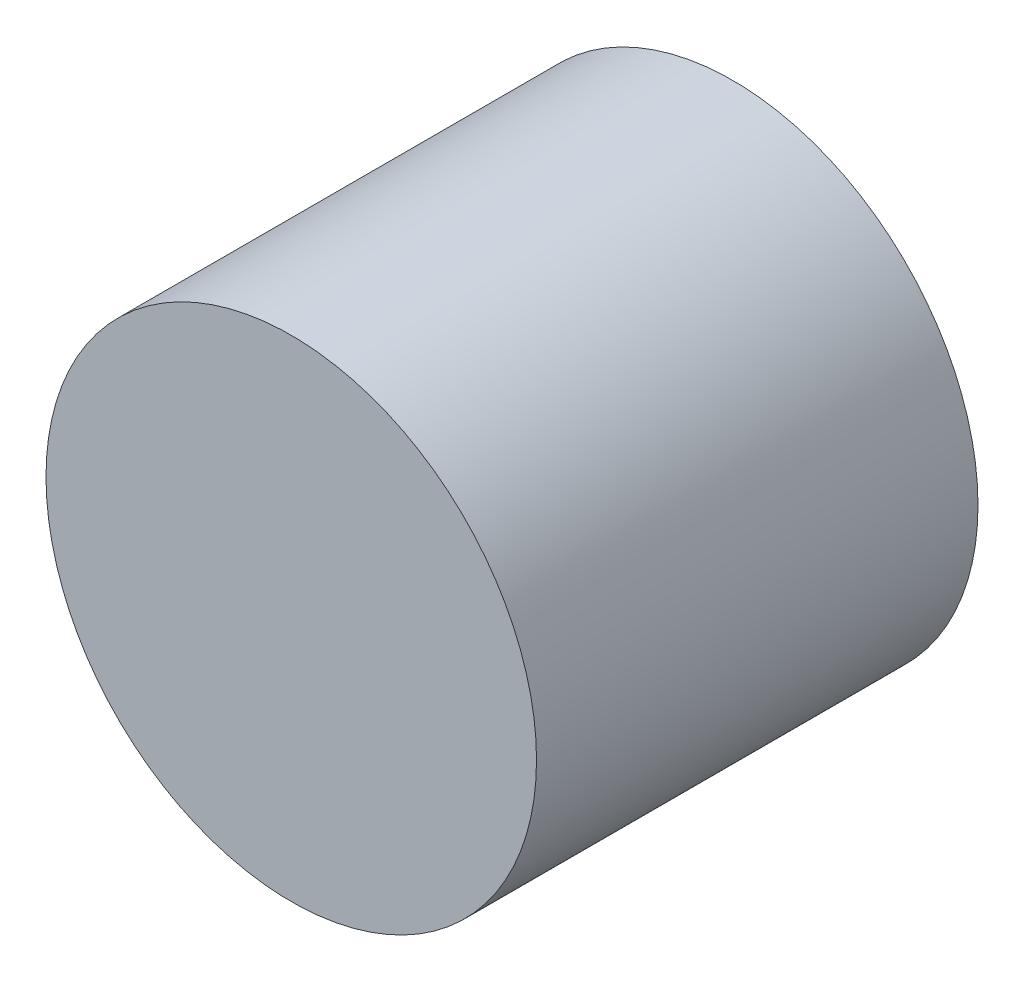
ISO-10303-21;
HEADER;
FILE_DESCRIPTION(('STEP AP214'),'2;1');
FILE_NAME('part.step','',(''),(''),'','','');
FILE_SCHEMA(('AUTOMOTIVE_DESIGN { 1 0 10303 214 1 1 1 1 }'));
ENDSEC;
DATA;
#1=APPLICATION_CONTEXT('core data for automotive mechanical design processes');
#2=APPLICATION_PROTOCOL_DEFINITION('international standard','automotive_design',2000,#1);
#3=PRODUCT_CONTEXT('',#1,'mechanical');
#4=PRODUCT('Part','Part','',(#3));
#5=PRODUCT_RELATED_PRODUCT_CATEGORY('part','',(#4));
#6=PRODUCT_DEFINITION_FORMATION('','',#4);
#7=PRODUCT_DEFINITION_CONTEXT('part definition',#1,'design');
#8=PRODUCT_DEFINITION('design','',#6,#7);
#9=PRODUCT_DEFINITION_SHAPE('','',#8);
#10=(LENGTH_UNIT() NAMED_UNIT(*) SI_UNIT(.MILLI.,.METRE.));
#11=(NAMED_UNIT(*) PLANE_ANGLE_UNIT() SI_UNIT($,.RADIAN.));
#12=(NAMED_UNIT(*) SI_UNIT($,.STERADIAN.) SOLID_ANGLE_UNIT());
#13=UNCERTAINTY_MEASURE_WITH_UNIT(LENGTH_MEASURE(1.E-05),#10,'distance_accuracy_value','');
#14=(GEOMETRIC_REPRESENTATION_CONTEXT(3) GLOBAL_UNCERTAINTY_ASSIGNED_CONTEXT((#13)) GLOBAL_UNIT_ASSIGNED_CONTEXT((#10,
#11,#12)) REPRESENTATION_CONTEXT('',''));
#15=CARTESIAN_POINT('',(0.,0.,0.));
#16=DIRECTION('',(0.,0.,1.));
#17=DIRECTION('',(1.,0.,0.));
#18=AXIS2_PLACEMENT_3D('',#15,#16,#17);
#19=CARTESIAN_POINT('',(0.,0.,0.));
#20=DIRECTION('',(0.,0.,-1.));
#21=DIRECTION('',(-1.,0.,0.));
#22=AXIS2_PLACEMENT_3D('',#19,#20,#21);
#23=PLANE('',#22);
#24=CARTESIAN_POINT('',(0.,0.,0.));
#25=DIRECTION('',(0.,0.,1.));
#26=DIRECTION('',(1.,0.,0.));
#27=AXIS2_PLACEMENT_3D('',#24,#25,#26);
#28=CIRCLE('',#27,5.);
#29=CARTESIAN_POINT('',(5.,0.,0.));
#30=VERTEX_POINT('',#29);
#31=EDGE_CURVE('E10',#30,#30,#28,.T.);
#32=ORIENTED_EDGE('',*,*,#31,.T.);
#33=EDGE_LOOP('',(#32));
#34=FACE_BOUND('',#33,.T.);
#35=ADVANCED_FACE('F33',(#34),#23,.F.);
#36=CARTESIAN_POINT('',(0.,0.,9.91616766467066));
#37=DIRECTION('',(0.,0.,1.));
#38=DIRECTION('',(1.,0.,0.));
#39=AXIS2_PLACEMENT_3D('',#36,#37,#38);
#40=CYLINDRICAL_SURFACE('',#39,5.);
#41=ORIENTED_EDGE('',*,*,#31,.F.);
#42=EDGE_LOOP('',(#41));
#43=FACE_BOUND('',#42,.T.);
#44=CARTESIAN_POINT('',(0.,0.,-9.));
#45=DIRECTION('',(0.,0.,1.));
#46=DIRECTION('',(1.,0.,0.));
#47=AXIS2_PLACEMENT_3D('',#44,#45,#46);
#48=CIRCLE('',#47,5.);
#49=CARTESIAN_POINT('',(5.,0.,-9.));
#50=VERTEX_POINT('',#49);
#51=EDGE_CURVE('E39',#50,#50,#48,.T.);
#52=ORIENTED_EDGE('',*,*,#51,.T.);
#53=EDGE_LOOP('',(#52));
#54=FACE_BOUND('',#53,.T.);
#55=ADVANCED_FACE('F68',(#43,#54),#40,.T.);
#56=CARTESIAN_POINT('',(0.,5.,-9.));
#57=DIRECTION('',(0.,0.,1.));
#58=DIRECTION('',(1.,0.,0.));
#59=AXIS2_PLACEMENT_3D('',#56,#57,#58);
#60=PLANE('',#59);
#61=ORIENTED_EDGE('',*,*,#51,.F.);
#62=EDGE_LOOP('',(#61));
#63=FACE_BOUND('',#62,.T.);
#64=CARTESIAN_POINT('',(0.,0.,-9.));
#65=DIRECTION('',(0.,0.,1.));
#66=DIRECTION('',(1.,0.,0.));
#67=AXIS2_PLACEMENT_3D('',#64,#65,#66);
#68=CIRCLE('',#67,3.);
#69=CARTESIAN_POINT('',(3.,0.,-9.));
#70=VERTEX_POINT('',#69);
#71=EDGE_CURVE('E43',#70,#70,#68,.T.);
#72=ORIENTED_EDGE('',*,*,#71,.T.);
#73=EDGE_LOOP('',(#72));
#74=FACE_BOUND('',#73,.T.);
#75=ADVANCED_FACE('F72',(#63,#74),#60,.F.);
#76=CARTESIAN_POINT('',(0.,0.,9.91616766467066));
#77=DIRECTION('',(0.,0.,1.));
#78=DIRECTION('',(1.,0.,0.));
#79=AXIS2_PLACEMENT_3D('',#76,#77,#78);
#80=CYLINDRICAL_SURFACE('',#79,3.);
#81=ORIENTED_EDGE('',*,*,#71,.F.);
#82=EDGE_LOOP('',(#81));
#83=FACE_BOUND('',#82,.T.);
#84=CARTESIAN_POINT('',(0.,0.,-3.5));
#85=DIRECTION('',(0.,0.,1.));
#86=DIRECTION('',(1.,0.,0.));
#87=AXIS2_PLACEMENT_3D('',#84,#85,#86);
#88=CIRCLE('',#87,3.);
#89=CARTESIAN_POINT('',(3.,0.,-3.5));
#90=VERTEX_POINT('',#89);
#91=EDGE_CURVE('E47',#90,#90,#88,.T.);
#92=ORIENTED_EDGE('',*,*,#91,.T.);
#93=EDGE_LOOP('',(#92));
#94=FACE_BOUND('',#93,.T.);
#95=ADVANCED_FACE('F64',(#83,#94),#80,.F.);
#96=CARTESIAN_POINT('',(0.,3.,-3.5));
#97=DIRECTION('',(0.,0.,-1.));
#98=DIRECTION('',(-1.,0.,0.));
#99=AXIS2_PLACEMENT_3D('',#96,#97,#98);
#100=PLANE('',#99);
#101=ORIENTED_EDGE('',*,*,#91,.F.);
#102=EDGE_LOOP('',(#101));
#103=FACE_BOUND('',#102,.T.);
#104=CARTESIAN_POINT('',(0.,0.,-3.5));
#105=DIRECTION('',(0.,0.,1.));
#106=DIRECTION('',(1.,0.,0.));
#107=AXIS2_PLACEMENT_3D('',#104,#105,#106);
#108=CIRCLE('',#107,4.5);
#109=CARTESIAN_POINT('',(4.5,0.,-3.5));
#110=VERTEX_POINT('',#109);
#111=EDGE_CURVE('E52',#110,#110,#108,.T.);
#112=ORIENTED_EDGE('',*,*,#111,.T.);
#113=EDGE_LOOP('',(#112));
#114=FACE_BOUND('',#113,.T.);
#115=ADVANCED_FACE('F56',(#103,#114),#100,.F.);
#116=CARTESIAN_POINT('',(0.,0.,-7.5625));
#117=DIRECTION('',(0.,0.,1.));
#118=DIRECTION('',(0.,-1.,0.));
#119=AXIS2_PLACEMENT_3D('',#116,#117,#118);
#120=SPHERICAL_SURFACE('',#119,6.0625);
#121=ORIENTED_EDGE('',*,*,#111,.F.);
#122=EDGE_LOOP('',(#121));
#123=FACE_BOUND('',#122,.T.);
#124=ADVANCED_FACE('F58',(#123),#120,.F.);
#125=CLOSED_SHELL('',(#35,#55,#75,#95,#115,#124));
#126=MANIFOLD_SOLID_BREP('B2',#125);
#127=ADVANCED_BREP_SHAPE_REPRESENTATION('',(#18,#126),#14);
#128=SHAPE_DEFINITION_REPRESENTATION(#9,#127);
ENDSEC;
END-ISO-10303-21;
